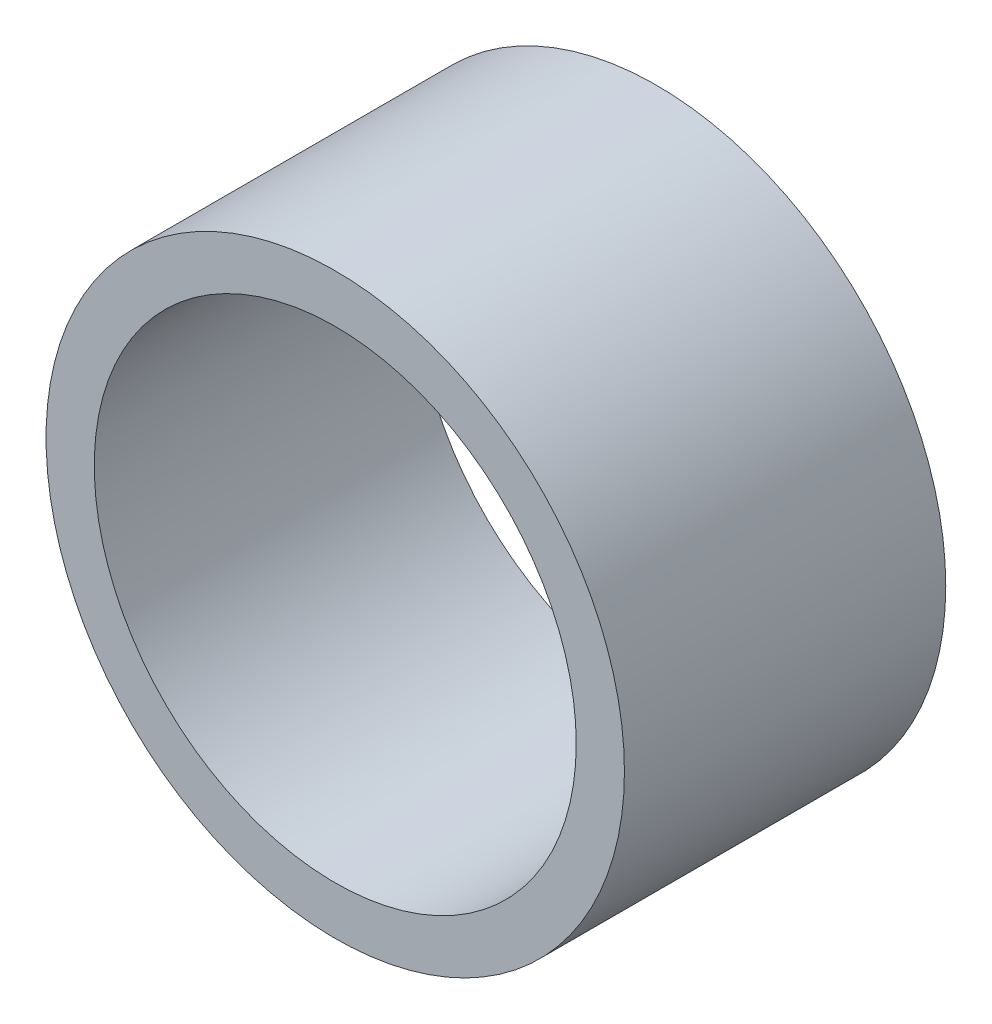
ISO-10303-21;
HEADER;
FILE_DESCRIPTION(('STEP AP214'),'2;1');
FILE_NAME('part.step','',(''),(''),'','','');
FILE_SCHEMA(('AUTOMOTIVE_DESIGN { 1 0 10303 214 1 1 1 1 }'));
ENDSEC;
DATA;
#1=APPLICATION_CONTEXT('core data for automotive mechanical design processes');
#2=APPLICATION_PROTOCOL_DEFINITION('international standard','automotive_design',2000,#1);
#3=PRODUCT_CONTEXT('',#1,'mechanical');
#4=PRODUCT('Part','Part','',(#3));
#5=PRODUCT_RELATED_PRODUCT_CATEGORY('part','',(#4));
#6=PRODUCT_DEFINITION_FORMATION('','',#4);
#7=PRODUCT_DEFINITION_CONTEXT('part definition',#1,'design');
#8=PRODUCT_DEFINITION('design','',#6,#7);
#9=PRODUCT_DEFINITION_SHAPE('','',#8);
#10=(LENGTH_UNIT() NAMED_UNIT(*) SI_UNIT(.MILLI.,.METRE.));
#11=(NAMED_UNIT(*) PLANE_ANGLE_UNIT() SI_UNIT($,.RADIAN.));
#12=(NAMED_UNIT(*) SI_UNIT($,.STERADIAN.) SOLID_ANGLE_UNIT());
#13=UNCERTAINTY_MEASURE_WITH_UNIT(LENGTH_MEASURE(1.E-05),#10,'distance_accuracy_value','');
#14=(GEOMETRIC_REPRESENTATION_CONTEXT(3) GLOBAL_UNCERTAINTY_ASSIGNED_CONTEXT((#13)) GLOBAL_UNIT_ASSIGNED_CONTEXT((#10,
#11,#12)) REPRESENTATION_CONTEXT('',''));
#15=CARTESIAN_POINT('',(0.,0.,0.));
#16=DIRECTION('',(0.,0.,1.));
#17=DIRECTION('',(1.,0.,0.));
#18=AXIS2_PLACEMENT_3D('',#15,#16,#17);
#19=CARTESIAN_POINT('',(0.,0.,5.));
#20=DIRECTION('',(0.,0.,1.));
#21=DIRECTION('',(1.,0.,0.));
#22=AXIS2_PLACEMENT_3D('',#19,#20,#21);
#23=PLANE('',#22);
#24=CARTESIAN_POINT('',(0.,0.,5.));
#25=DIRECTION('',(0.,0.,1.));
#26=DIRECTION('',(1.,0.,0.));
#27=AXIS2_PLACEMENT_3D('',#24,#25,#26);
#28=CIRCLE('',#27,9.);
#29=CARTESIAN_POINT('',(9.,0.,5.));
#30=VERTEX_POINT('',#29);
#31=EDGE_CURVE('E10',#30,#30,#28,.T.);
#32=ORIENTED_EDGE('',*,*,#31,.T.);
#33=EDGE_LOOP('',(#32));
#34=FACE_BOUND('',#33,.T.);
#35=CARTESIAN_POINT('',(0.,0.,5.));
#36=DIRECTION('',(0.,0.,1.));
#37=DIRECTION('',(1.,0.,0.));
#38=AXIS2_PLACEMENT_3D('',#35,#36,#37);
#39=CIRCLE('',#38,7.5);
#40=CARTESIAN_POINT('',(7.5,0.,5.));
#41=VERTEX_POINT('',#40);
#42=EDGE_CURVE('E48',#41,#41,#39,.T.);
#43=ORIENTED_EDGE('',*,*,#42,.F.);
#44=EDGE_LOOP('',(#43));
#45=FACE_BOUND('',#44,.T.);
#46=ADVANCED_FACE('F37',(#34,#45),#23,.T.);
#47=CARTESIAN_POINT('',(0.,0.,-5.));
#48=DIRECTION('',(0.,0.,1.));
#49=DIRECTION('',(1.,0.,0.));
#50=AXIS2_PLACEMENT_3D('',#47,#48,#49);
#51=PLANE('',#50);
#52=CARTESIAN_POINT('',(0.,0.,-5.));
#53=DIRECTION('',(0.,0.,1.));
#54=DIRECTION('',(1.,0.,0.));
#55=AXIS2_PLACEMENT_3D('',#52,#53,#54);
#56=CIRCLE('',#55,9.);
#57=CARTESIAN_POINT('',(9.,0.,-5.));
#58=VERTEX_POINT('',#57);
#59=EDGE_CURVE('E41',#58,#58,#56,.T.);
#60=ORIENTED_EDGE('',*,*,#59,.F.);
#61=EDGE_LOOP('',(#60));
#62=FACE_BOUND('',#61,.T.);
#63=CARTESIAN_POINT('',(0.,0.,-5.));
#64=DIRECTION('',(0.,0.,1.));
#65=DIRECTION('',(1.,0.,0.));
#66=AXIS2_PLACEMENT_3D('',#63,#64,#65);
#67=CIRCLE('',#66,7.5);
#68=CARTESIAN_POINT('',(7.5,0.,-5.));
#69=VERTEX_POINT('',#68);
#70=EDGE_CURVE('E50',#69,#69,#67,.T.);
#71=ORIENTED_EDGE('',*,*,#70,.T.);
#72=EDGE_LOOP('',(#71));
#73=FACE_BOUND('',#72,.T.);
#74=ADVANCED_FACE('F60',(#62,#73),#51,.F.);
#75=CARTESIAN_POINT('',(0.,0.,5.));
#76=DIRECTION('',(0.,0.,-1.));
#77=DIRECTION('',(-1.,0.,0.));
#78=AXIS2_PLACEMENT_3D('',#75,#76,#77);
#79=CYLINDRICAL_SURFACE('',#78,9.);
#80=ORIENTED_EDGE('',*,*,#31,.F.);
#81=EDGE_LOOP('',(#80));
#82=FACE_BOUND('',#81,.T.);
#83=ORIENTED_EDGE('',*,*,#59,.T.);
#84=EDGE_LOOP('',(#83));
#85=FACE_BOUND('',#84,.T.);
#86=ADVANCED_FACE('F39',(#82,#85),#79,.T.);
#87=CARTESIAN_POINT('',(0.,0.,5.));
#88=DIRECTION('',(0.,0.,-1.));
#89=DIRECTION('',(-1.,0.,0.));
#90=AXIS2_PLACEMENT_3D('',#87,#88,#89);
#91=CYLINDRICAL_SURFACE('',#90,7.5);
#92=ORIENTED_EDGE('',*,*,#42,.T.);
#93=EDGE_LOOP('',(#92));
#94=FACE_BOUND('',#93,.T.);
#95=ORIENTED_EDGE('',*,*,#70,.F.);
#96=EDGE_LOOP('',(#95));
#97=FACE_BOUND('',#96,.T.);
#98=ADVANCED_FACE('F56',(#94,#97),#91,.F.);
#99=CLOSED_SHELL('',(#46,#74,#86,#98));
#100=MANIFOLD_SOLID_BREP('B2',#99);
#101=ADVANCED_BREP_SHAPE_REPRESENTATION('',(#18,#100),#14);
#102=SHAPE_DEFINITION_REPRESENTATION(#9,#101);
ENDSEC;
END-ISO-10303-21;
